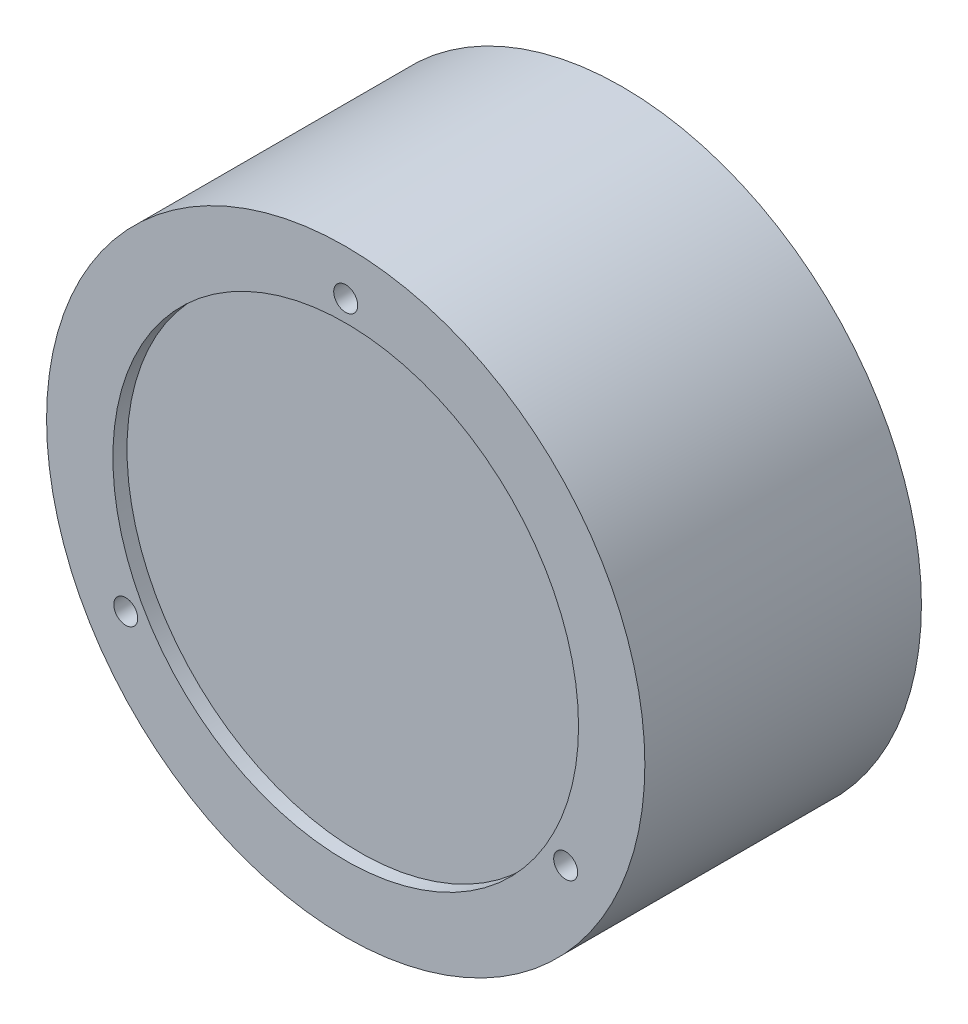
ISO-10303-21;
HEADER;
FILE_DESCRIPTION(('STEP AP214'),'2;1');
FILE_NAME('part.step','',(''),(''),'','','');
FILE_SCHEMA(('AUTOMOTIVE_DESIGN { 1 0 10303 214 1 1 1 1 }'));
ENDSEC;
DATA;
#1=APPLICATION_CONTEXT('core data for automotive mechanical design processes');
#2=APPLICATION_PROTOCOL_DEFINITION('international standard','automotive_design',2000,#1);
#3=PRODUCT_CONTEXT('',#1,'mechanical');
#4=PRODUCT('Part','Part','',(#3));
#5=PRODUCT_RELATED_PRODUCT_CATEGORY('part','',(#4));
#6=PRODUCT_DEFINITION_FORMATION('','',#4);
#7=PRODUCT_DEFINITION_CONTEXT('part definition',#1,'design');
#8=PRODUCT_DEFINITION('design','',#6,#7);
#9=PRODUCT_DEFINITION_SHAPE('','',#8);
#10=(LENGTH_UNIT() NAMED_UNIT(*) SI_UNIT(.MILLI.,.METRE.));
#11=(NAMED_UNIT(*) PLANE_ANGLE_UNIT() SI_UNIT($,.RADIAN.));
#12=(NAMED_UNIT(*) SI_UNIT($,.STERADIAN.) SOLID_ANGLE_UNIT());
#13=UNCERTAINTY_MEASURE_WITH_UNIT(LENGTH_MEASURE(1.E-05),#10,'distance_accuracy_value','');
#14=(GEOMETRIC_REPRESENTATION_CONTEXT(3) GLOBAL_UNCERTAINTY_ASSIGNED_CONTEXT((#13)) GLOBAL_UNIT_ASSIGNED_CONTEXT((#10,
#11,#12)) REPRESENTATION_CONTEXT('',''));
#15=CARTESIAN_POINT('',(0.,0.,0.));
#16=DIRECTION('',(0.,0.,1.));
#17=DIRECTION('',(1.,0.,0.));
#18=AXIS2_PLACEMENT_3D('',#15,#16,#17);
#19=CARTESIAN_POINT('',(0.,0.,98.));
#20=DIRECTION('',(0.,0.,-1.));
#21=DIRECTION('',(-1.,0.,0.));
#22=AXIS2_PLACEMENT_3D('',#19,#20,#21);
#23=CYLINDRICAL_SURFACE('',#22,106.);
#24=CARTESIAN_POINT('',(0.,0.,98.));
#25=DIRECTION('',(0.,0.,1.));
#26=DIRECTION('',(1.,0.,0.));
#27=AXIS2_PLACEMENT_3D('',#24,#25,#26);
#28=CIRCLE('',#27,106.);
#29=CARTESIAN_POINT('',(106.,0.,98.));
#30=VERTEX_POINT('',#29);
#31=EDGE_CURVE('E11',#30,#30,#28,.T.);
#32=ORIENTED_EDGE('',*,*,#31,.F.);
#33=EDGE_LOOP('',(#32));
#34=FACE_BOUND('',#33,.T.);
#35=CARTESIAN_POINT('',(0.,0.,0.));
#36=DIRECTION('',(0.,0.,1.));
#37=DIRECTION('',(1.,0.,0.));
#38=AXIS2_PLACEMENT_3D('',#35,#36,#37);
#39=CIRCLE('',#38,106.);
#40=CARTESIAN_POINT('',(106.,0.,0.));
#41=VERTEX_POINT('',#40);
#42=EDGE_CURVE('E43',#41,#41,#39,.T.);
#43=ORIENTED_EDGE('',*,*,#42,.T.);
#44=EDGE_LOOP('',(#43));
#45=FACE_BOUND('',#44,.T.);
#46=ADVANCED_FACE('F40',(#34,#45),#23,.T.);
#47=CARTESIAN_POINT('',(0.,0.,98.));
#48=DIRECTION('',(0.,0.,1.));
#49=DIRECTION('',(1.,0.,0.));
#50=AXIS2_PLACEMENT_3D('',#47,#48,#49);
#51=PLANE('',#50);
#52=CARTESIAN_POINT('',(-77.9422863405999,-44.9999999999993,98.));
#53=DIRECTION('',(0.,0.,1.));
#54=DIRECTION('',(1.,0.,0.));
#55=AXIS2_PLACEMENT_3D('',#52,#53,#54);
#56=CIRCLE('',#55,4.24999999999999);
#57=CARTESIAN_POINT('',(-73.6922863405999,-44.9999999999993,98.));
#58=VERTEX_POINT('',#57);
#59=EDGE_CURVE('E120',#58,#58,#56,.T.);
#60=ORIENTED_EDGE('',*,*,#59,.F.);
#61=EDGE_LOOP('',(#60));
#62=FACE_BOUND('',#61,.T.);
#63=CARTESIAN_POINT('',(77.9422863405993,-45.0000000000004,98.));
#64=DIRECTION('',(0.,0.,1.));
#65=DIRECTION('',(1.,0.,0.));
#66=AXIS2_PLACEMENT_3D('',#63,#64,#65);
#67=CIRCLE('',#66,4.24999999999999);
#68=CARTESIAN_POINT('',(82.1922863405993,-45.0000000000004,98.));
#69=VERTEX_POINT('',#68);
#70=EDGE_CURVE('E126',#69,#69,#67,.T.);
#71=ORIENTED_EDGE('',*,*,#70,.F.);
#72=EDGE_LOOP('',(#71));
#73=FACE_BOUND('',#72,.T.);
#74=CARTESIAN_POINT('',(0.,90.,98.));
#75=DIRECTION('',(0.,0.,1.));
#76=DIRECTION('',(1.,0.,0.));
#77=AXIS2_PLACEMENT_3D('',#74,#75,#76);
#78=CIRCLE('',#77,4.24999999999999);
#79=CARTESIAN_POINT('',(4.24999999999999,90.,98.));
#80=VERTEX_POINT('',#79);
#81=EDGE_CURVE('E132',#80,#80,#78,.T.);
#82=ORIENTED_EDGE('',*,*,#81,.F.);
#83=EDGE_LOOP('',(#82));
#84=FACE_BOUND('',#83,.T.);
#85=CARTESIAN_POINT('',(0.,0.,98.));
#86=DIRECTION('',(0.,0.,1.));
#87=DIRECTION('',(1.,0.,0.));
#88=AXIS2_PLACEMENT_3D('',#85,#86,#87);
#89=CIRCLE('',#88,82.5);
#90=CARTESIAN_POINT('',(82.5,0.,98.));
#91=VERTEX_POINT('',#90);
#92=EDGE_CURVE('E138',#91,#91,#89,.T.);
#93=ORIENTED_EDGE('',*,*,#92,.F.);
#94=EDGE_LOOP('',(#93));
#95=FACE_BOUND('',#94,.T.);
#96=ORIENTED_EDGE('',*,*,#31,.T.);
#97=EDGE_LOOP('',(#96));
#98=FACE_BOUND('',#97,.T.);
#99=ADVANCED_FACE('F147',(#62,#73,#84,#95,#98),#51,.T.);
#100=CARTESIAN_POINT('',(0.,0.,0.));
#101=DIRECTION('',(0.,0.,1.));
#102=DIRECTION('',(1.,0.,0.));
#103=AXIS2_PLACEMENT_3D('',#100,#101,#102);
#104=PLANE('',#103);
#105=CARTESIAN_POINT('',(-86.6025403784443,-49.9999999999992,0.));
#106=DIRECTION('',(0.,0.,-1.));
#107=DIRECTION('',(-1.,0.,0.));
#108=AXIS2_PLACEMENT_3D('',#105,#106,#107);
#109=CIRCLE('',#108,4.24999999999999);
#110=CARTESIAN_POINT('',(-90.8525403784443,-49.9999999999992,0.));
#111=VERTEX_POINT('',#110);
#112=EDGE_CURVE('E86',#111,#111,#109,.T.);
#113=ORIENTED_EDGE('',*,*,#112,.F.);
#114=EDGE_LOOP('',(#113));
#115=FACE_BOUND('',#114,.T.);
#116=CARTESIAN_POINT('',(-64.9519052838332,-37.4999999999994,0.));
#117=DIRECTION('',(0.,0.,-1.));
#118=DIRECTION('',(-1.,0.,0.));
#119=AXIS2_PLACEMENT_3D('',#116,#117,#118);
#120=CIRCLE('',#119,4.24999999999999);
#121=CARTESIAN_POINT('',(-69.2019052838332,-37.4999999999994,0.));
#122=VERTEX_POINT('',#121);
#123=EDGE_CURVE('E85',#122,#122,#120,.T.);
#124=ORIENTED_EDGE('',*,*,#123,.F.);
#125=EDGE_LOOP('',(#124));
#126=FACE_BOUND('',#125,.T.);
#127=CARTESIAN_POINT('',(86.6025403784437,-50.0000000000004,0.));
#128=DIRECTION('',(0.,0.,-1.));
#129=DIRECTION('',(-1.,0.,0.));
#130=AXIS2_PLACEMENT_3D('',#127,#128,#129);
#131=CIRCLE('',#130,4.24999999999999);
#132=CARTESIAN_POINT('',(82.3525403784437,-50.0000000000004,0.));
#133=VERTEX_POINT('',#132);
#134=EDGE_CURVE('E96',#133,#133,#131,.T.);
#135=ORIENTED_EDGE('',*,*,#134,.F.);
#136=EDGE_LOOP('',(#135));
#137=FACE_BOUND('',#136,.T.);
#138=CARTESIAN_POINT('',(64.9519052838327,-37.5000000000003,0.));
#139=DIRECTION('',(0.,0.,-1.));
#140=DIRECTION('',(-1.,0.,0.));
#141=AXIS2_PLACEMENT_3D('',#138,#139,#140);
#142=CIRCLE('',#141,4.24999999999999);
#143=CARTESIAN_POINT('',(60.7019052838328,-37.5000000000003,0.));
#144=VERTEX_POINT('',#143);
#145=EDGE_CURVE('E102',#144,#144,#142,.T.);
#146=ORIENTED_EDGE('',*,*,#145,.F.);
#147=EDGE_LOOP('',(#146));
#148=FACE_BOUND('',#147,.T.);
#149=CARTESIAN_POINT('',(0.,100.,0.));
#150=DIRECTION('',(0.,0.,-1.));
#151=DIRECTION('',(-1.,0.,0.));
#152=AXIS2_PLACEMENT_3D('',#149,#150,#151);
#153=CIRCLE('',#152,4.24999999999999);
#154=CARTESIAN_POINT('',(-4.24999999999999,100.,0.));
#155=VERTEX_POINT('',#154);
#156=EDGE_CURVE('E108',#155,#155,#153,.T.);
#157=ORIENTED_EDGE('',*,*,#156,.F.);
#158=EDGE_LOOP('',(#157));
#159=FACE_BOUND('',#158,.T.);
#160=CARTESIAN_POINT('',(0.,75.,0.));
#161=DIRECTION('',(0.,0.,-1.));
#162=DIRECTION('',(-1.,0.,0.));
#163=AXIS2_PLACEMENT_3D('',#160,#161,#162);
#164=CIRCLE('',#163,4.24999999999999);
#165=CARTESIAN_POINT('',(-4.24999999999999,75.,0.));
#166=VERTEX_POINT('',#165);
#167=EDGE_CURVE('E114',#166,#166,#164,.T.);
#168=ORIENTED_EDGE('',*,*,#167,.F.);
#169=EDGE_LOOP('',(#168));
#170=FACE_BOUND('',#169,.T.);
#171=ORIENTED_EDGE('',*,*,#42,.F.);
#172=EDGE_LOOP('',(#171));
#173=FACE_BOUND('',#172,.T.);
#174=ADVANCED_FACE('F150',(#115,#126,#137,#148,#159,#170,#173),#104,.F.);
#175=CARTESIAN_POINT('',(0.,0.,93.));
#176=DIRECTION('',(0.,0.,1.));
#177=DIRECTION('',(1.,0.,0.));
#178=AXIS2_PLACEMENT_3D('',#175,#176,#177);
#179=CYLINDRICAL_SURFACE('',#178,82.5);
#180=CARTESIAN_POINT('',(0.,0.,93.));
#181=DIRECTION('',(0.,0.,1.));
#182=DIRECTION('',(1.,0.,0.));
#183=AXIS2_PLACEMENT_3D('',#180,#181,#182);
#184=CIRCLE('',#183,82.5);
#185=CARTESIAN_POINT('',(82.5,0.,93.));
#186=VERTEX_POINT('',#185);
#187=EDGE_CURVE('E139',#186,#186,#184,.T.);
#188=ORIENTED_EDGE('',*,*,#187,.F.);
#189=EDGE_LOOP('',(#188));
#190=FACE_BOUND('',#189,.T.);
#191=ORIENTED_EDGE('',*,*,#92,.T.);
#192=EDGE_LOOP('',(#191));
#193=FACE_BOUND('',#192,.T.);
#194=ADVANCED_FACE('F145',(#190,#193),#179,.F.);
#195=CARTESIAN_POINT('',(0.,0.,93.));
#196=DIRECTION('',(0.,0.,1.));
#197=DIRECTION('',(1.,0.,0.));
#198=AXIS2_PLACEMENT_3D('',#195,#196,#197);
#199=PLANE('',#198);
#200=ORIENTED_EDGE('',*,*,#187,.T.);
#201=EDGE_LOOP('',(#200));
#202=FACE_BOUND('',#201,.T.);
#203=ADVANCED_FACE('F165',(#202),#199,.T.);
#204=CARTESIAN_POINT('',(0.,90.,68.));
#205=DIRECTION('',(0.,0.,1.));
#206=DIRECTION('',(1.,0.,0.));
#207=AXIS2_PLACEMENT_3D('',#204,#205,#206);
#208=CONICAL_SURFACE('',#207,4.24999999999999,1.02974425867665);
#209=CARTESIAN_POINT('',(0.,90.,65.4463423691329));
#210=VERTEX_POINT('',#209);
#211=VERTEX_LOOP('',#210);
#212=FACE_BOUND('',#211,.T.);
#213=CARTESIAN_POINT('',(0.,90.,68.));
#214=DIRECTION('',(0.,0.,1.));
#215=DIRECTION('',(1.,0.,0.));
#216=AXIS2_PLACEMENT_3D('',#213,#214,#215);
#217=CIRCLE('',#216,4.24999999999999);
#218=CARTESIAN_POINT('',(4.24999999999999,90.,68.));
#219=VERTEX_POINT('',#218);
#220=EDGE_CURVE('E135',#219,#219,#217,.T.);
#221=ORIENTED_EDGE('',*,*,#220,.T.);
#222=EDGE_LOOP('',(#221));
#223=FACE_BOUND('',#222,.T.);
#224=ADVANCED_FACE('F173',(#212,#223),#208,.F.);
#225=CARTESIAN_POINT('',(0.,90.,98.));
#226=DIRECTION('',(0.,0.,1.));
#227=DIRECTION('',(1.,0.,0.));
#228=AXIS2_PLACEMENT_3D('',#225,#226,#227);
#229=CYLINDRICAL_SURFACE('',#228,4.24999999999999);
#230=ORIENTED_EDGE('',*,*,#220,.F.);
#231=EDGE_LOOP('',(#230));
#232=FACE_BOUND('',#231,.T.);
#233=ORIENTED_EDGE('',*,*,#81,.T.);
#234=EDGE_LOOP('',(#233));
#235=FACE_BOUND('',#234,.T.);
#236=ADVANCED_FACE('F177',(#232,#235),#229,.F.);
#237=CARTESIAN_POINT('',(77.9422863405993,-45.0000000000004,68.));
#238=DIRECTION('',(0.,0.,1.));
#239=DIRECTION('',(1.,0.,0.));
#240=AXIS2_PLACEMENT_3D('',#237,#238,#239);
#241=CONICAL_SURFACE('',#240,4.24999999999999,1.02974425867665);
#242=CARTESIAN_POINT('',(77.9422863405993,-45.0000000000004,65.4463423691329));
#243=VERTEX_POINT('',#242);
#244=VERTEX_LOOP('',#243);
#245=FACE_BOUND('',#244,.T.);
#246=CARTESIAN_POINT('',(77.9422863405993,-45.0000000000004,68.));
#247=DIRECTION('',(0.,0.,1.));
#248=DIRECTION('',(1.,0.,0.));
#249=AXIS2_PLACEMENT_3D('',#246,#247,#248);
#250=CIRCLE('',#249,4.24999999999999);
#251=CARTESIAN_POINT('',(82.1922863405993,-45.0000000000004,68.));
#252=VERTEX_POINT('',#251);
#253=EDGE_CURVE('E129',#252,#252,#250,.T.);
#254=ORIENTED_EDGE('',*,*,#253,.T.);
#255=EDGE_LOOP('',(#254));
#256=FACE_BOUND('',#255,.T.);
#257=ADVANCED_FACE('F180',(#245,#256),#241,.F.);
#258=CARTESIAN_POINT('',(77.9422863405993,-45.0000000000004,98.));
#259=DIRECTION('',(0.,0.,1.));
#260=DIRECTION('',(1.,0.,0.));
#261=AXIS2_PLACEMENT_3D('',#258,#259,#260);
#262=CYLINDRICAL_SURFACE('',#261,4.24999999999999);
#263=ORIENTED_EDGE('',*,*,#253,.F.);
#264=EDGE_LOOP('',(#263));
#265=FACE_BOUND('',#264,.T.);
#266=ORIENTED_EDGE('',*,*,#70,.T.);
#267=EDGE_LOOP('',(#266));
#268=FACE_BOUND('',#267,.T.);
#269=ADVANCED_FACE('F184',(#265,#268),#262,.F.);
#270=CARTESIAN_POINT('',(-77.9422863405999,-44.9999999999993,68.));
#271=DIRECTION('',(0.,0.,1.));
#272=DIRECTION('',(1.,0.,0.));
#273=AXIS2_PLACEMENT_3D('',#270,#271,#272);
#274=CONICAL_SURFACE('',#273,4.24999999999999,1.02974425867665);
#275=CARTESIAN_POINT('',(-77.9422863405999,-44.9999999999993,65.4463423691329));
#276=VERTEX_POINT('',#275);
#277=VERTEX_LOOP('',#276);
#278=FACE_BOUND('',#277,.T.);
#279=CARTESIAN_POINT('',(-77.9422863405999,-44.9999999999993,68.));
#280=DIRECTION('',(0.,0.,1.));
#281=DIRECTION('',(1.,0.,0.));
#282=AXIS2_PLACEMENT_3D('',#279,#280,#281);
#283=CIRCLE('',#282,4.24999999999999);
#284=CARTESIAN_POINT('',(-73.6922863405999,-44.9999999999993,68.));
#285=VERTEX_POINT('',#284);
#286=EDGE_CURVE('E123',#285,#285,#283,.T.);
#287=ORIENTED_EDGE('',*,*,#286,.T.);
#288=EDGE_LOOP('',(#287));
#289=FACE_BOUND('',#288,.T.);
#290=ADVANCED_FACE('F187',(#278,#289),#274,.F.);
#291=CARTESIAN_POINT('',(-77.9422863405999,-44.9999999999993,98.));
#292=DIRECTION('',(0.,0.,1.));
#293=DIRECTION('',(1.,0.,0.));
#294=AXIS2_PLACEMENT_3D('',#291,#292,#293);
#295=CYLINDRICAL_SURFACE('',#294,4.24999999999999);
#296=ORIENTED_EDGE('',*,*,#286,.F.);
#297=EDGE_LOOP('',(#296));
#298=FACE_BOUND('',#297,.T.);
#299=ORIENTED_EDGE('',*,*,#59,.T.);
#300=EDGE_LOOP('',(#299));
#301=FACE_BOUND('',#300,.T.);
#302=ADVANCED_FACE('F191',(#298,#301),#295,.F.);
#303=CARTESIAN_POINT('',(0.,75.,24.5));
#304=DIRECTION('',(0.,0.,-1.));
#305=DIRECTION('',(-1.,0.,0.));
#306=AXIS2_PLACEMENT_3D('',#303,#304,#305);
#307=CONICAL_SURFACE('',#306,4.24999999999999,1.02974425867665);
#308=CARTESIAN_POINT('',(0.,75.,27.0536576308671));
#309=VERTEX_POINT('',#308);
#310=VERTEX_LOOP('',#309);
#311=FACE_BOUND('',#310,.T.);
#312=CARTESIAN_POINT('',(0.,75.,24.5));
#313=DIRECTION('',(0.,0.,-1.));
#314=DIRECTION('',(-1.,0.,0.));
#315=AXIS2_PLACEMENT_3D('',#312,#313,#314);
#316=CIRCLE('',#315,4.24999999999999);
#317=CARTESIAN_POINT('',(-4.24999999999999,75.,24.5));
#318=VERTEX_POINT('',#317);
#319=EDGE_CURVE('E117',#318,#318,#316,.T.);
#320=ORIENTED_EDGE('',*,*,#319,.T.);
#321=EDGE_LOOP('',(#320));
#322=FACE_BOUND('',#321,.T.);
#323=ADVANCED_FACE('F195',(#311,#322),#307,.F.);
#324=CARTESIAN_POINT('',(0.,75.,0.));
#325=DIRECTION('',(0.,0.,-1.));
#326=DIRECTION('',(-1.,0.,0.));
#327=AXIS2_PLACEMENT_3D('',#324,#325,#326);
#328=CYLINDRICAL_SURFACE('',#327,4.24999999999999);
#329=ORIENTED_EDGE('',*,*,#319,.F.);
#330=EDGE_LOOP('',(#329));
#331=FACE_BOUND('',#330,.T.);
#332=ORIENTED_EDGE('',*,*,#167,.T.);
#333=EDGE_LOOP('',(#332));
#334=FACE_BOUND('',#333,.T.);
#335=ADVANCED_FACE('F199',(#331,#334),#328,.F.);
#336=CARTESIAN_POINT('',(0.,100.,24.5));
#337=DIRECTION('',(0.,0.,-1.));
#338=DIRECTION('',(-1.,0.,0.));
#339=AXIS2_PLACEMENT_3D('',#336,#337,#338);
#340=CONICAL_SURFACE('',#339,4.24999999999999,1.02974425867665);
#341=CARTESIAN_POINT('',(0.,100.,27.0536576308671));
#342=VERTEX_POINT('',#341);
#343=VERTEX_LOOP('',#342);
#344=FACE_BOUND('',#343,.T.);
#345=CARTESIAN_POINT('',(0.,100.,24.5));
#346=DIRECTION('',(0.,0.,-1.));
#347=DIRECTION('',(-1.,0.,0.));
#348=AXIS2_PLACEMENT_3D('',#345,#346,#347);
#349=CIRCLE('',#348,4.24999999999999);
#350=CARTESIAN_POINT('',(-4.24999999999999,100.,24.5));
#351=VERTEX_POINT('',#350);
#352=EDGE_CURVE('E111',#351,#351,#349,.T.);
#353=ORIENTED_EDGE('',*,*,#352,.T.);
#354=EDGE_LOOP('',(#353));
#355=FACE_BOUND('',#354,.T.);
#356=ADVANCED_FACE('F203',(#344,#355),#340,.F.);
#357=CARTESIAN_POINT('',(0.,100.,0.));
#358=DIRECTION('',(0.,0.,-1.));
#359=DIRECTION('',(-1.,0.,0.));
#360=AXIS2_PLACEMENT_3D('',#357,#358,#359);
#361=CYLINDRICAL_SURFACE('',#360,4.24999999999999);
#362=ORIENTED_EDGE('',*,*,#352,.F.);
#363=EDGE_LOOP('',(#362));
#364=FACE_BOUND('',#363,.T.);
#365=ORIENTED_EDGE('',*,*,#156,.T.);
#366=EDGE_LOOP('',(#365));
#367=FACE_BOUND('',#366,.T.);
#368=ADVANCED_FACE('F207',(#364,#367),#361,.F.);
#369=CARTESIAN_POINT('',(64.9519052838327,-37.5000000000003,24.5));
#370=DIRECTION('',(0.,0.,-1.));
#371=DIRECTION('',(-1.,0.,0.));
#372=AXIS2_PLACEMENT_3D('',#369,#370,#371);
#373=CONICAL_SURFACE('',#372,4.24999999999999,1.02974425867665);
#374=CARTESIAN_POINT('',(64.9519052838327,-37.5000000000003,27.0536576308671));
#375=VERTEX_POINT('',#374);
#376=VERTEX_LOOP('',#375);
#377=FACE_BOUND('',#376,.T.);
#378=CARTESIAN_POINT('',(64.9519052838327,-37.5000000000003,24.5));
#379=DIRECTION('',(0.,0.,-1.));
#380=DIRECTION('',(-1.,0.,0.));
#381=AXIS2_PLACEMENT_3D('',#378,#379,#380);
#382=CIRCLE('',#381,4.24999999999999);
#383=CARTESIAN_POINT('',(60.7019052838328,-37.5000000000003,24.5));
#384=VERTEX_POINT('',#383);
#385=EDGE_CURVE('E105',#384,#384,#382,.T.);
#386=ORIENTED_EDGE('',*,*,#385,.T.);
#387=EDGE_LOOP('',(#386));
#388=FACE_BOUND('',#387,.T.);
#389=ADVANCED_FACE('F211',(#377,#388),#373,.F.);
#390=CARTESIAN_POINT('',(64.9519052838327,-37.5000000000003,0.));
#391=DIRECTION('',(0.,0.,-1.));
#392=DIRECTION('',(-1.,0.,0.));
#393=AXIS2_PLACEMENT_3D('',#390,#391,#392);
#394=CYLINDRICAL_SURFACE('',#393,4.24999999999999);
#395=ORIENTED_EDGE('',*,*,#385,.F.);
#396=EDGE_LOOP('',(#395));
#397=FACE_BOUND('',#396,.T.);
#398=ORIENTED_EDGE('',*,*,#145,.T.);
#399=EDGE_LOOP('',(#398));
#400=FACE_BOUND('',#399,.T.);
#401=ADVANCED_FACE('F215',(#397,#400),#394,.F.);
#402=CARTESIAN_POINT('',(86.6025403784437,-50.0000000000004,24.5));
#403=DIRECTION('',(0.,0.,-1.));
#404=DIRECTION('',(-1.,0.,0.));
#405=AXIS2_PLACEMENT_3D('',#402,#403,#404);
#406=CONICAL_SURFACE('',#405,4.24999999999999,1.02974425867665);
#407=CARTESIAN_POINT('',(86.6025403784437,-50.0000000000004,27.0536576308671));
#408=VERTEX_POINT('',#407);
#409=VERTEX_LOOP('',#408);
#410=FACE_BOUND('',#409,.T.);
#411=CARTESIAN_POINT('',(86.6025403784437,-50.0000000000004,24.5));
#412=DIRECTION('',(0.,0.,-1.));
#413=DIRECTION('',(-1.,0.,0.));
#414=AXIS2_PLACEMENT_3D('',#411,#412,#413);
#415=CIRCLE('',#414,4.24999999999999);
#416=CARTESIAN_POINT('',(82.3525403784437,-50.0000000000004,24.5));
#417=VERTEX_POINT('',#416);
#418=EDGE_CURVE('E99',#417,#417,#415,.T.);
#419=ORIENTED_EDGE('',*,*,#418,.T.);
#420=EDGE_LOOP('',(#419));
#421=FACE_BOUND('',#420,.T.);
#422=ADVANCED_FACE('F219',(#410,#421),#406,.F.);
#423=CARTESIAN_POINT('',(86.6025403784437,-50.0000000000004,0.));
#424=DIRECTION('',(0.,0.,-1.));
#425=DIRECTION('',(-1.,0.,0.));
#426=AXIS2_PLACEMENT_3D('',#423,#424,#425);
#427=CYLINDRICAL_SURFACE('',#426,4.24999999999999);
#428=ORIENTED_EDGE('',*,*,#418,.F.);
#429=EDGE_LOOP('',(#428));
#430=FACE_BOUND('',#429,.T.);
#431=ORIENTED_EDGE('',*,*,#134,.T.);
#432=EDGE_LOOP('',(#431));
#433=FACE_BOUND('',#432,.T.);
#434=ADVANCED_FACE('F223',(#430,#433),#427,.F.);
#435=CARTESIAN_POINT('',(-64.9519052838332,-37.4999999999994,24.5));
#436=DIRECTION('',(0.,0.,-1.));
#437=DIRECTION('',(-1.,0.,0.));
#438=AXIS2_PLACEMENT_3D('',#435,#436,#437);
#439=CONICAL_SURFACE('',#438,4.25,1.02974425867665);
#440=CARTESIAN_POINT('',(-64.9519052838332,-37.4999999999994,27.0536576308671));
#441=VERTEX_POINT('',#440);
#442=VERTEX_LOOP('',#441);
#443=FACE_BOUND('',#442,.T.);
#444=CARTESIAN_POINT('',(-64.9519052838332,-37.4999999999994,24.5));
#445=DIRECTION('',(0.,0.,-1.));
#446=DIRECTION('',(-1.,0.,0.));
#447=AXIS2_PLACEMENT_3D('',#444,#445,#446);
#448=CIRCLE('',#447,4.25);
#449=CARTESIAN_POINT('',(-69.2019052838332,-37.4999999999994,24.5));
#450=VERTEX_POINT('',#449);
#451=EDGE_CURVE('E89',#450,#450,#448,.T.);
#452=ORIENTED_EDGE('',*,*,#451,.T.);
#453=EDGE_LOOP('',(#452));
#454=FACE_BOUND('',#453,.T.);
#455=ADVANCED_FACE('F227',(#443,#454),#439,.F.);
#456=CARTESIAN_POINT('',(-64.9519052838332,-37.4999999999994,0.));
#457=DIRECTION('',(0.,0.,-1.));
#458=DIRECTION('',(-1.,0.,0.));
#459=AXIS2_PLACEMENT_3D('',#456,#457,#458);
#460=CYLINDRICAL_SURFACE('',#459,4.24999999999999);
#461=ORIENTED_EDGE('',*,*,#451,.F.);
#462=EDGE_LOOP('',(#461));
#463=FACE_BOUND('',#462,.T.);
#464=ORIENTED_EDGE('',*,*,#123,.T.);
#465=EDGE_LOOP('',(#464));
#466=FACE_BOUND('',#465,.T.);
#467=ADVANCED_FACE('F79',(#463,#466),#460,.F.);
#468=CARTESIAN_POINT('',(-86.6025403784443,-49.9999999999992,24.5));
#469=DIRECTION('',(0.,0.,-1.));
#470=DIRECTION('',(-1.,0.,0.));
#471=AXIS2_PLACEMENT_3D('',#468,#469,#470);
#472=CONICAL_SURFACE('',#471,4.24999999999999,1.02974425867665);
#473=CARTESIAN_POINT('',(-86.6025403784443,-49.9999999999992,27.0536576308671));
#474=VERTEX_POINT('',#473);
#475=VERTEX_LOOP('',#474);
#476=FACE_BOUND('',#475,.T.);
#477=CARTESIAN_POINT('',(-86.6025403784443,-49.9999999999992,24.5));
#478=DIRECTION('',(0.,0.,-1.));
#479=DIRECTION('',(-1.,0.,0.));
#480=AXIS2_PLACEMENT_3D('',#477,#478,#479);
#481=CIRCLE('',#480,4.24999999999999);
#482=CARTESIAN_POINT('',(-90.8525403784443,-49.9999999999992,24.5));
#483=VERTEX_POINT('',#482);
#484=EDGE_CURVE('E83',#483,#483,#481,.T.);
#485=ORIENTED_EDGE('',*,*,#484,.T.);
#486=EDGE_LOOP('',(#485));
#487=FACE_BOUND('',#486,.T.);
#488=ADVANCED_FACE('F75',(#476,#487),#472,.F.);
#489=CARTESIAN_POINT('',(-86.6025403784443,-49.9999999999992,0.));
#490=DIRECTION('',(0.,0.,-1.));
#491=DIRECTION('',(-1.,0.,0.));
#492=AXIS2_PLACEMENT_3D('',#489,#490,#491);
#493=CYLINDRICAL_SURFACE('',#492,4.24999999999999);
#494=ORIENTED_EDGE('',*,*,#484,.F.);
#495=EDGE_LOOP('',(#494));
#496=FACE_BOUND('',#495,.T.);
#497=ORIENTED_EDGE('',*,*,#112,.T.);
#498=EDGE_LOOP('',(#497));
#499=FACE_BOUND('',#498,.T.);
#500=ADVANCED_FACE('F78',(#496,#499),#493,.F.);
#501=CLOSED_SHELL('',(#46,#99,#174,#194,#203,#224,#236,#257,#269,#290,#302,#323,#335,#356,#368,
#389,#401,#422,#434,#455,#467,#488,#500));
#502=MANIFOLD_SOLID_BREP('B2',#501);
#503=ADVANCED_BREP_SHAPE_REPRESENTATION('',(#18,#502),#14);
#504=SHAPE_DEFINITION_REPRESENTATION(#9,#503);
ENDSEC;
END-ISO-10303-21;
